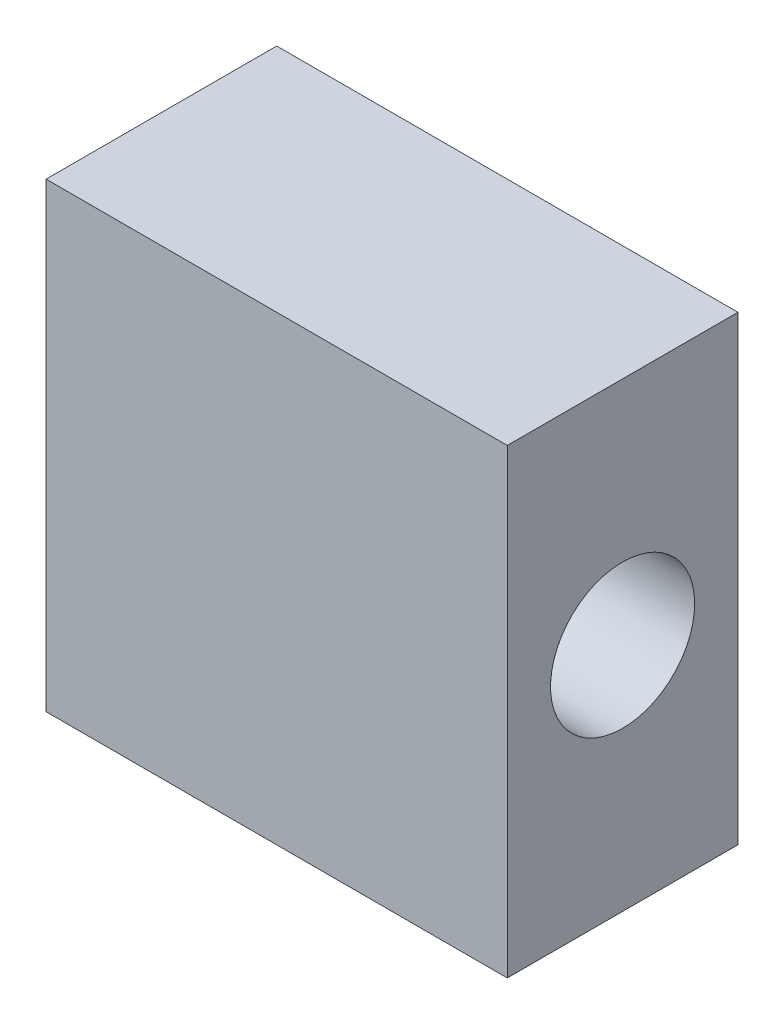
ISO-10303-21;
HEADER;
FILE_DESCRIPTION(('STEP AP214'),'2;1');
FILE_NAME('part.step','',(''),(''),'','','');
FILE_SCHEMA(('AUTOMOTIVE_DESIGN { 1 0 10303 214 1 1 1 1 }'));
ENDSEC;
DATA;
#1=APPLICATION_CONTEXT('core data for automotive mechanical design processes');
#2=APPLICATION_PROTOCOL_DEFINITION('international standard','automotive_design',2000,#1);
#3=PRODUCT_CONTEXT('',#1,'mechanical');
#4=PRODUCT('Part','Part','',(#3));
#5=PRODUCT_RELATED_PRODUCT_CATEGORY('part','',(#4));
#6=PRODUCT_DEFINITION_FORMATION('','',#4);
#7=PRODUCT_DEFINITION_CONTEXT('part definition',#1,'design');
#8=PRODUCT_DEFINITION('design','',#6,#7);
#9=PRODUCT_DEFINITION_SHAPE('','',#8);
#10=(LENGTH_UNIT() NAMED_UNIT(*) SI_UNIT(.MILLI.,.METRE.));
#11=(NAMED_UNIT(*) PLANE_ANGLE_UNIT() SI_UNIT($,.RADIAN.));
#12=(NAMED_UNIT(*) SI_UNIT($,.STERADIAN.) SOLID_ANGLE_UNIT());
#13=UNCERTAINTY_MEASURE_WITH_UNIT(LENGTH_MEASURE(1.E-05),#10,'distance_accuracy_value','');
#14=(GEOMETRIC_REPRESENTATION_CONTEXT(3) GLOBAL_UNCERTAINTY_ASSIGNED_CONTEXT((#13)) GLOBAL_UNIT_ASSIGNED_CONTEXT((#10,
#11,#12)) REPRESENTATION_CONTEXT('',''));
#15=CARTESIAN_POINT('',(0.,0.,0.));
#16=DIRECTION('',(0.,0.,1.));
#17=DIRECTION('',(1.,0.,0.));
#18=AXIS2_PLACEMENT_3D('',#15,#16,#17);
#19=CARTESIAN_POINT('',(0.,0.,25.4));
#20=DIRECTION('',(1.,0.,0.));
#21=DIRECTION('',(0.,0.,-1.));
#22=AXIS2_PLACEMENT_3D('',#19,#20,#21);
#23=PLANE('',#22);
#24=DIRECTION('',(0.,-1.,0.));
#25=VECTOR('',#24,1.);
#26=CARTESIAN_POINT('',(0.,0.,0.));
#27=LINE('',#26,#25);
#28=CARTESIAN_POINT('',(0.,50.8,0.));
#29=VERTEX_POINT('',#28);
#30=CARTESIAN_POINT('',(0.,0.,0.));
#31=VERTEX_POINT('',#30);
#32=EDGE_CURVE('E98',#29,#31,#27,.T.);
#33=ORIENTED_EDGE('',*,*,#32,.T.);
#34=DIRECTION('',(0.,0.,-1.));
#35=VECTOR('',#34,1.);
#36=CARTESIAN_POINT('',(0.,0.,25.4));
#37=LINE('',#36,#35);
#38=CARTESIAN_POINT('',(0.,0.,25.4));
#39=VERTEX_POINT('',#38);
#40=EDGE_CURVE('E11',#39,#31,#37,.T.);
#41=ORIENTED_EDGE('',*,*,#40,.F.);
#42=DIRECTION('',(0.,-1.,0.));
#43=VECTOR('',#42,1.);
#44=CARTESIAN_POINT('',(0.,0.,25.4));
#45=LINE('',#44,#43);
#46=CARTESIAN_POINT('',(0.,50.8,25.4));
#47=VERTEX_POINT('',#46);
#48=EDGE_CURVE('E86',#47,#39,#45,.T.);
#49=ORIENTED_EDGE('',*,*,#48,.F.);
#50=DIRECTION('',(0.,0.,-1.));
#51=VECTOR('',#50,1.);
#52=CARTESIAN_POINT('',(0.,50.8,25.4));
#53=LINE('',#52,#51);
#54=EDGE_CURVE('E94',#47,#29,#53,.T.);
#55=ORIENTED_EDGE('',*,*,#54,.T.);
#56=EDGE_LOOP('',(#33,#41,#49,#55));
#57=FACE_BOUND('',#56,.T.);
#58=ADVANCED_FACE('F35',(#57),#23,.F.);
#59=CARTESIAN_POINT('',(0.,0.,25.4));
#60=DIRECTION('',(0.,1.,0.));
#61=DIRECTION('',(0.,0.,1.));
#62=AXIS2_PLACEMENT_3D('',#59,#60,#61);
#63=PLANE('',#62);
#64=DIRECTION('',(1.,0.,0.));
#65=VECTOR('',#64,1.);
#66=CARTESIAN_POINT('',(0.,0.,0.));
#67=LINE('',#66,#65);
#68=CARTESIAN_POINT('',(50.8,0.,0.));
#69=VERTEX_POINT('',#68);
#70=EDGE_CURVE('E90',#31,#69,#67,.T.);
#71=ORIENTED_EDGE('',*,*,#70,.T.);
#72=DIRECTION('',(0.,0.,-1.));
#73=VECTOR('',#72,1.);
#74=CARTESIAN_POINT('',(50.8,0.,25.4));
#75=LINE('',#74,#73);
#76=CARTESIAN_POINT('',(50.8,0.,25.4));
#77=VERTEX_POINT('',#76);
#78=EDGE_CURVE('E43',#77,#69,#75,.T.);
#79=ORIENTED_EDGE('',*,*,#78,.F.);
#80=DIRECTION('',(1.,0.,0.));
#81=VECTOR('',#80,1.);
#82=CARTESIAN_POINT('',(0.,0.,25.4));
#83=LINE('',#82,#81);
#84=EDGE_CURVE('E81',#39,#77,#83,.T.);
#85=ORIENTED_EDGE('',*,*,#84,.F.);
#86=ORIENTED_EDGE('',*,*,#40,.T.);
#87=EDGE_LOOP('',(#71,#79,#85,#86));
#88=FACE_BOUND('',#87,.T.);
#89=ADVANCED_FACE('F89',(#88),#63,.F.);
#90=CARTESIAN_POINT('',(50.8,0.,25.4));
#91=DIRECTION('',(-1.,0.,0.));
#92=DIRECTION('',(0.,0.,1.));
#93=AXIS2_PLACEMENT_3D('',#90,#91,#92);
#94=PLANE('',#93);
#95=CARTESIAN_POINT('',(50.8,25.4,12.7));
#96=DIRECTION('',(1.,0.,0.));
#97=DIRECTION('',(0.,0.,-1.));
#98=AXIS2_PLACEMENT_3D('',#95,#96,#97);
#99=CIRCLE('',#98,7.9375);
#100=CARTESIAN_POINT('',(50.8,25.4,4.7625));
#101=VERTEX_POINT('',#100);
#102=EDGE_CURVE('E112',#101,#101,#99,.T.);
#103=ORIENTED_EDGE('',*,*,#102,.F.);
#104=EDGE_LOOP('',(#103));
#105=FACE_BOUND('',#104,.T.);
#106=DIRECTION('',(0.,1.,0.));
#107=VECTOR('',#106,1.);
#108=CARTESIAN_POINT('',(50.8,0.,0.));
#109=LINE('',#108,#107);
#110=CARTESIAN_POINT('',(50.8,50.8,0.));
#111=VERTEX_POINT('',#110);
#112=EDGE_CURVE('E68',#69,#111,#109,.T.);
#113=ORIENTED_EDGE('',*,*,#112,.T.);
#114=DIRECTION('',(0.,0.,-1.));
#115=VECTOR('',#114,1.);
#116=CARTESIAN_POINT('',(50.8,50.8,25.4));
#117=LINE('',#116,#115);
#118=CARTESIAN_POINT('',(50.8,50.8,25.4));
#119=VERTEX_POINT('',#118);
#120=EDGE_CURVE('E91',#119,#111,#117,.T.);
#121=ORIENTED_EDGE('',*,*,#120,.F.);
#122=DIRECTION('',(0.,1.,0.));
#123=VECTOR('',#122,1.);
#124=CARTESIAN_POINT('',(50.8,0.,25.4));
#125=LINE('',#124,#123);
#126=EDGE_CURVE('E84',#77,#119,#125,.T.);
#127=ORIENTED_EDGE('',*,*,#126,.F.);
#128=ORIENTED_EDGE('',*,*,#78,.T.);
#129=EDGE_LOOP('',(#113,#121,#127,#128));
#130=FACE_BOUND('',#129,.T.);
#131=ADVANCED_FACE('F92',(#105,#130),#94,.F.);
#132=CARTESIAN_POINT('',(0.,50.8,25.4));
#133=DIRECTION('',(0.,-1.,0.));
#134=DIRECTION('',(0.,0.,-1.));
#135=AXIS2_PLACEMENT_3D('',#132,#133,#134);
#136=PLANE('',#135);
#137=DIRECTION('',(-1.,0.,0.));
#138=VECTOR('',#137,1.);
#139=CARTESIAN_POINT('',(0.,50.8,0.));
#140=LINE('',#139,#138);
#141=EDGE_CURVE('E74',#111,#29,#140,.T.);
#142=ORIENTED_EDGE('',*,*,#141,.T.);
#143=ORIENTED_EDGE('',*,*,#54,.F.);
#144=DIRECTION('',(-1.,0.,0.));
#145=VECTOR('',#144,1.);
#146=CARTESIAN_POINT('',(0.,50.8,25.4));
#147=LINE('',#146,#145);
#148=EDGE_CURVE('E51',#119,#47,#147,.T.);
#149=ORIENTED_EDGE('',*,*,#148,.F.);
#150=ORIENTED_EDGE('',*,*,#120,.T.);
#151=EDGE_LOOP('',(#142,#143,#149,#150));
#152=FACE_BOUND('',#151,.T.);
#153=ADVANCED_FACE('F106',(#152),#136,.F.);
#154=CARTESIAN_POINT('',(0.,0.,25.4));
#155=DIRECTION('',(0.,0.,-1.));
#156=DIRECTION('',(-1.,0.,0.));
#157=AXIS2_PLACEMENT_3D('',#154,#155,#156);
#158=PLANE('',#157);
#159=ORIENTED_EDGE('',*,*,#48,.T.);
#160=ORIENTED_EDGE('',*,*,#84,.T.);
#161=ORIENTED_EDGE('',*,*,#126,.T.);
#162=ORIENTED_EDGE('',*,*,#148,.T.);
#163=EDGE_LOOP('',(#159,#160,#161,#162));
#164=FACE_BOUND('',#163,.T.);
#165=ADVANCED_FACE('F82',(#164),#158,.F.);
#166=CARTESIAN_POINT('',(0.,0.,0.));
#167=DIRECTION('',(0.,0.,-1.));
#168=DIRECTION('',(-1.,0.,0.));
#169=AXIS2_PLACEMENT_3D('',#166,#167,#168);
#170=PLANE('',#169);
#171=ORIENTED_EDGE('',*,*,#32,.F.);
#172=ORIENTED_EDGE('',*,*,#141,.F.);
#173=ORIENTED_EDGE('',*,*,#112,.F.);
#174=ORIENTED_EDGE('',*,*,#70,.F.);
#175=EDGE_LOOP('',(#171,#172,#173,#174));
#176=FACE_BOUND('',#175,.T.);
#177=ADVANCED_FACE('F109',(#176),#170,.T.);
#178=CARTESIAN_POINT('',(25.4,25.4,12.7));
#179=DIRECTION('',(1.,0.,0.));
#180=DIRECTION('',(0.,0.,-1.));
#181=AXIS2_PLACEMENT_3D('',#178,#179,#180);
#182=CYLINDRICAL_SURFACE('',#181,7.9375);
#183=CARTESIAN_POINT('',(25.4,25.4,12.7));
#184=DIRECTION('',(1.,0.,0.));
#185=DIRECTION('',(0.,0.,-1.));
#186=AXIS2_PLACEMENT_3D('',#183,#184,#185);
#187=CIRCLE('',#186,7.9375);
#188=CARTESIAN_POINT('',(25.4,25.4,4.7625));
#189=VERTEX_POINT('',#188);
#190=EDGE_CURVE('E101',#189,#189,#187,.T.);
#191=ORIENTED_EDGE('',*,*,#190,.F.);
#192=EDGE_LOOP('',(#191));
#193=FACE_BOUND('',#192,.T.);
#194=ORIENTED_EDGE('',*,*,#102,.T.);
#195=EDGE_LOOP('',(#194));
#196=FACE_BOUND('',#195,.T.);
#197=ADVANCED_FACE('F120',(#193,#196),#182,.F.);
#198=CARTESIAN_POINT('',(25.4,25.4,12.7));
#199=DIRECTION('',(1.,0.,0.));
#200=DIRECTION('',(0.,0.,-1.));
#201=AXIS2_PLACEMENT_3D('',#198,#199,#200);
#202=PLANE('',#201);
#203=ORIENTED_EDGE('',*,*,#190,.T.);
#204=EDGE_LOOP('',(#203));
#205=FACE_BOUND('',#204,.T.);
#206=ADVANCED_FACE('F118',(#205),#202,.T.);
#207=CLOSED_SHELL('',(#58,#89,#131,#153,#165,#177,#197,#206));
#208=MANIFOLD_SOLID_BREP('B2',#207);
#209=ADVANCED_BREP_SHAPE_REPRESENTATION('',(#18,#208),#14);
#210=SHAPE_DEFINITION_REPRESENTATION(#9,#209);
ENDSEC;
END-ISO-10303-21;
